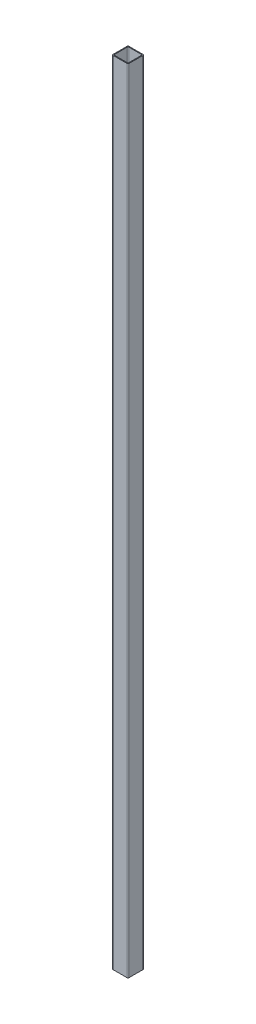
ISO-10303-21;
HEADER;
FILE_DESCRIPTION(('STEP AP214'),'2;1');
FILE_NAME('part.step','',(''),(''),'','','');
FILE_SCHEMA(('AUTOMOTIVE_DESIGN { 1 0 10303 214 1 1 1 1 }'));
ENDSEC;
DATA;
#1=APPLICATION_CONTEXT('core data for automotive mechanical design processes');
#2=APPLICATION_PROTOCOL_DEFINITION('international standard','automotive_design',2000,#1);
#3=PRODUCT_CONTEXT('',#1,'mechanical');
#4=PRODUCT('Part','Part','',(#3));
#5=PRODUCT_RELATED_PRODUCT_CATEGORY('part','',(#4));
#6=PRODUCT_DEFINITION_FORMATION('','',#4);
#7=PRODUCT_DEFINITION_CONTEXT('part definition',#1,'design');
#8=PRODUCT_DEFINITION('design','',#6,#7);
#9=PRODUCT_DEFINITION_SHAPE('','',#8);
#10=(LENGTH_UNIT() NAMED_UNIT(*) SI_UNIT(.MILLI.,.METRE.));
#11=(NAMED_UNIT(*) PLANE_ANGLE_UNIT() SI_UNIT($,.RADIAN.));
#12=(NAMED_UNIT(*) SI_UNIT($,.STERADIAN.) SOLID_ANGLE_UNIT());
#13=UNCERTAINTY_MEASURE_WITH_UNIT(LENGTH_MEASURE(1.E-05),#10,'distance_accuracy_value','');
#14=(GEOMETRIC_REPRESENTATION_CONTEXT(3) GLOBAL_UNCERTAINTY_ASSIGNED_CONTEXT((#13)) GLOBAL_UNIT_ASSIGNED_CONTEXT((#10,
#11,#12)) REPRESENTATION_CONTEXT('',''));
#15=CARTESIAN_POINT('',(0.,0.,0.));
#16=DIRECTION('',(0.,0.,1.));
#17=DIRECTION('',(1.,0.,0.));
#18=AXIS2_PLACEMENT_3D('',#15,#16,#17);
#19=CARTESIAN_POINT('',(18.,2000.,18.));
#20=DIRECTION('',(0.,1.,0.));
#21=DIRECTION('',(0.,0.,1.));
#22=AXIS2_PLACEMENT_3D('',#19,#20,#21);
#23=PLANE('',#22);
#24=CARTESIAN_POINT('',(18.,2000.,18.));
#25=DIRECTION('',(0.,1.,0.));
#26=DIRECTION('',(0.,0.,1.));
#27=AXIS2_PLACEMENT_3D('',#24,#25,#26);
#28=CIRCLE('',#27,2.);
#29=CARTESIAN_POINT('',(18.,2000.,20.));
#30=VERTEX_POINT('',#29);
#31=CARTESIAN_POINT('',(20.,2000.,18.));
#32=VERTEX_POINT('',#31);
#33=EDGE_CURVE('E213',#30,#32,#28,.T.);
#34=ORIENTED_EDGE('',*,*,#33,.T.);
#35=DIRECTION('',(0.,0.,-1.));
#36=VECTOR('',#35,1.);
#37=CARTESIAN_POINT('',(20.,2000.,-18.));
#38=LINE('',#37,#36);
#39=CARTESIAN_POINT('',(20.,2000.,-18.));
#40=VERTEX_POINT('',#39);
#41=EDGE_CURVE('E216',#32,#40,#38,.T.);
#42=ORIENTED_EDGE('',*,*,#41,.T.);
#43=CARTESIAN_POINT('',(18.,2000.,-18.));
#44=DIRECTION('',(0.,1.,0.));
#45=DIRECTION('',(0.,0.,-1.));
#46=AXIS2_PLACEMENT_3D('',#43,#44,#45);
#47=CIRCLE('',#46,2.);
#48=CARTESIAN_POINT('',(18.,2000.,-20.));
#49=VERTEX_POINT('',#48);
#50=EDGE_CURVE('E219',#40,#49,#47,.T.);
#51=ORIENTED_EDGE('',*,*,#50,.T.);
#52=DIRECTION('',(-1.,0.,0.));
#53=VECTOR('',#52,1.);
#54=CARTESIAN_POINT('',(-18.,2000.,-20.));
#55=LINE('',#54,#53);
#56=CARTESIAN_POINT('',(-18.,2000.,-20.));
#57=VERTEX_POINT('',#56);
#58=EDGE_CURVE('E221',#49,#57,#55,.T.);
#59=ORIENTED_EDGE('',*,*,#58,.T.);
#60=CARTESIAN_POINT('',(-18.,2000.,-18.));
#61=DIRECTION('',(0.,1.,0.));
#62=DIRECTION('',(0.,0.,1.));
#63=AXIS2_PLACEMENT_3D('',#60,#61,#62);
#64=CIRCLE('',#63,2.);
#65=CARTESIAN_POINT('',(-20.,2000.,-18.));
#66=VERTEX_POINT('',#65);
#67=EDGE_CURVE('E223',#57,#66,#64,.T.);
#68=ORIENTED_EDGE('',*,*,#67,.T.);
#69=DIRECTION('',(0.,0.,1.));
#70=VECTOR('',#69,1.);
#71=CARTESIAN_POINT('',(-20.,2000.,-18.));
#72=LINE('',#71,#70);
#73=CARTESIAN_POINT('',(-20.,2000.,18.));
#74=VERTEX_POINT('',#73);
#75=EDGE_CURVE('E225',#66,#74,#72,.T.);
#76=ORIENTED_EDGE('',*,*,#75,.T.);
#77=CARTESIAN_POINT('',(-18.,2000.,18.));
#78=DIRECTION('',(0.,1.,0.));
#79=DIRECTION('',(0.,0.,1.));
#80=AXIS2_PLACEMENT_3D('',#77,#78,#79);
#81=CIRCLE('',#80,2.);
#82=CARTESIAN_POINT('',(-18.,2000.,20.));
#83=VERTEX_POINT('',#82);
#84=EDGE_CURVE('E227',#74,#83,#81,.T.);
#85=ORIENTED_EDGE('',*,*,#84,.T.);
#86=DIRECTION('',(1.,0.,0.));
#87=VECTOR('',#86,1.);
#88=CARTESIAN_POINT('',(-18.,2000.,20.));
#89=LINE('',#88,#87);
#90=EDGE_CURVE('E229',#83,#30,#89,.T.);
#91=ORIENTED_EDGE('',*,*,#90,.T.);
#92=EDGE_LOOP('',(#34,#42,#51,#59,#68,#76,#85,#91));
#93=FACE_BOUND('',#92,.T.);
#94=DIRECTION('',(0.,0.,-1.));
#95=VECTOR('',#94,1.);
#96=CARTESIAN_POINT('',(18.,2000.,16.));
#97=LINE('',#96,#95);
#98=CARTESIAN_POINT('',(18.,2000.,16.));
#99=VERTEX_POINT('',#98);
#100=CARTESIAN_POINT('',(18.,2000.,-16.));
#101=VERTEX_POINT('',#100);
#102=EDGE_CURVE('E156',#99,#101,#97,.T.);
#103=ORIENTED_EDGE('',*,*,#102,.F.);
#104=CARTESIAN_POINT('',(16.,2000.,16.));
#105=DIRECTION('',(0.,1.,0.));
#106=DIRECTION('',(0.,0.,1.));
#107=AXIS2_PLACEMENT_3D('',#104,#105,#106);
#108=CIRCLE('',#107,2.);
#109=CARTESIAN_POINT('',(16.,2000.,18.));
#110=VERTEX_POINT('',#109);
#111=EDGE_CURVE('E148',#110,#99,#108,.T.);
#112=ORIENTED_EDGE('',*,*,#111,.F.);
#113=DIRECTION('',(1.,0.,0.));
#114=VECTOR('',#113,1.);
#115=CARTESIAN_POINT('',(16.,2000.,18.));
#116=LINE('',#115,#114);
#117=CARTESIAN_POINT('',(-16.,2000.,18.));
#118=VERTEX_POINT('',#117);
#119=EDGE_CURVE('E181',#118,#110,#116,.T.);
#120=ORIENTED_EDGE('',*,*,#119,.F.);
#121=CARTESIAN_POINT('',(-16.,2000.,16.));
#122=DIRECTION('',(0.,1.,0.));
#123=DIRECTION('',(0.,0.,-1.));
#124=AXIS2_PLACEMENT_3D('',#121,#122,#123);
#125=CIRCLE('',#124,2.);
#126=CARTESIAN_POINT('',(-18.,2000.,16.));
#127=VERTEX_POINT('',#126);
#128=EDGE_CURVE('E179',#127,#118,#125,.T.);
#129=ORIENTED_EDGE('',*,*,#128,.F.);
#130=DIRECTION('',(0.,0.,1.));
#131=VECTOR('',#130,1.);
#132=CARTESIAN_POINT('',(-18.,2000.,16.));
#133=LINE('',#132,#131);
#134=CARTESIAN_POINT('',(-18.,2000.,-16.));
#135=VERTEX_POINT('',#134);
#136=EDGE_CURVE('E177',#135,#127,#133,.T.);
#137=ORIENTED_EDGE('',*,*,#136,.F.);
#138=CARTESIAN_POINT('',(-16.,2000.,-16.));
#139=DIRECTION('',(0.,1.,0.));
#140=DIRECTION('',(0.,0.,1.));
#141=AXIS2_PLACEMENT_3D('',#138,#139,#140);
#142=CIRCLE('',#141,2.);
#143=CARTESIAN_POINT('',(-16.,2000.,-18.));
#144=VERTEX_POINT('',#143);
#145=EDGE_CURVE('E175',#144,#135,#142,.T.);
#146=ORIENTED_EDGE('',*,*,#145,.F.);
#147=DIRECTION('',(-1.,0.,0.));
#148=VECTOR('',#147,1.);
#149=CARTESIAN_POINT('',(16.,2000.,-18.));
#150=LINE('',#149,#148);
#151=CARTESIAN_POINT('',(16.,2000.,-18.));
#152=VERTEX_POINT('',#151);
#153=EDGE_CURVE('E171',#152,#144,#150,.T.);
#154=ORIENTED_EDGE('',*,*,#153,.F.);
#155=CARTESIAN_POINT('',(16.,2000.,-16.));
#156=DIRECTION('',(0.,1.,0.));
#157=DIRECTION('',(0.,0.,1.));
#158=AXIS2_PLACEMENT_3D('',#155,#156,#157);
#159=CIRCLE('',#158,2.);
#160=EDGE_CURVE('E169',#101,#152,#159,.T.);
#161=ORIENTED_EDGE('',*,*,#160,.F.);
#162=EDGE_LOOP('',(#103,#112,#120,#129,#137,#146,#154,#161));
#163=FACE_BOUND('',#162,.T.);
#164=ADVANCED_FACE('F35',(#93,#163),#23,.T.);
#165=CARTESIAN_POINT('',(18.,0.,18.));
#166=DIRECTION('',(0.,1.,0.));
#167=DIRECTION('',(0.,0.,1.));
#168=AXIS2_PLACEMENT_3D('',#165,#166,#167);
#169=PLANE('',#168);
#170=CARTESIAN_POINT('',(18.,0.,18.));
#171=DIRECTION('',(0.,1.,0.));
#172=DIRECTION('',(0.,0.,1.));
#173=AXIS2_PLACEMENT_3D('',#170,#171,#172);
#174=CIRCLE('',#173,2.);
#175=CARTESIAN_POINT('',(18.,0.,20.));
#176=VERTEX_POINT('',#175);
#177=CARTESIAN_POINT('',(20.,0.,18.));
#178=VERTEX_POINT('',#177);
#179=EDGE_CURVE('E164',#176,#178,#174,.T.);
#180=ORIENTED_EDGE('',*,*,#179,.F.);
#181=DIRECTION('',(1.,0.,0.));
#182=VECTOR('',#181,1.);
#183=CARTESIAN_POINT('',(-18.,0.,20.));
#184=LINE('',#183,#182);
#185=CARTESIAN_POINT('',(-18.,0.,20.));
#186=VERTEX_POINT('',#185);
#187=EDGE_CURVE('E217',#186,#176,#184,.T.);
#188=ORIENTED_EDGE('',*,*,#187,.F.);
#189=CARTESIAN_POINT('',(-18.,0.,18.));
#190=DIRECTION('',(0.,1.,0.));
#191=DIRECTION('',(0.,0.,1.));
#192=AXIS2_PLACEMENT_3D('',#189,#190,#191);
#193=CIRCLE('',#192,2.);
#194=CARTESIAN_POINT('',(-20.,0.,18.));
#195=VERTEX_POINT('',#194);
#196=EDGE_CURVE('E244',#195,#186,#193,.T.);
#197=ORIENTED_EDGE('',*,*,#196,.F.);
#198=DIRECTION('',(0.,0.,1.));
#199=VECTOR('',#198,1.);
#200=CARTESIAN_POINT('',(-20.,0.,-18.));
#201=LINE('',#200,#199);
#202=CARTESIAN_POINT('',(-20.,0.,-18.));
#203=VERTEX_POINT('',#202);
#204=EDGE_CURVE('E242',#203,#195,#201,.T.);
#205=ORIENTED_EDGE('',*,*,#204,.F.);
#206=CARTESIAN_POINT('',(-18.,0.,-18.));
#207=DIRECTION('',(0.,1.,0.));
#208=DIRECTION('',(0.,0.,1.));
#209=AXIS2_PLACEMENT_3D('',#206,#207,#208);
#210=CIRCLE('',#209,2.);
#211=CARTESIAN_POINT('',(-18.,0.,-20.));
#212=VERTEX_POINT('',#211);
#213=EDGE_CURVE('E240',#212,#203,#210,.T.);
#214=ORIENTED_EDGE('',*,*,#213,.F.);
#215=DIRECTION('',(-1.,0.,0.));
#216=VECTOR('',#215,1.);
#217=CARTESIAN_POINT('',(-18.,0.,-20.));
#218=LINE('',#217,#216);
#219=CARTESIAN_POINT('',(18.,0.,-20.));
#220=VERTEX_POINT('',#219);
#221=EDGE_CURVE('E238',#220,#212,#218,.T.);
#222=ORIENTED_EDGE('',*,*,#221,.F.);
#223=CARTESIAN_POINT('',(18.,0.,-18.));
#224=DIRECTION('',(0.,1.,0.));
#225=DIRECTION('',(0.,0.,-1.));
#226=AXIS2_PLACEMENT_3D('',#223,#224,#225);
#227=CIRCLE('',#226,2.);
#228=CARTESIAN_POINT('',(20.,0.,-18.));
#229=VERTEX_POINT('',#228);
#230=EDGE_CURVE('E236',#229,#220,#227,.T.);
#231=ORIENTED_EDGE('',*,*,#230,.F.);
#232=DIRECTION('',(0.,0.,-1.));
#233=VECTOR('',#232,1.);
#234=CARTESIAN_POINT('',(20.,0.,-18.));
#235=LINE('',#234,#233);
#236=EDGE_CURVE('E234',#178,#229,#235,.T.);
#237=ORIENTED_EDGE('',*,*,#236,.F.);
#238=EDGE_LOOP('',(#180,#188,#197,#205,#214,#222,#231,#237));
#239=FACE_BOUND('',#238,.T.);
#240=CARTESIAN_POINT('',(16.,0.,16.));
#241=DIRECTION('',(0.,1.,0.));
#242=DIRECTION('',(0.,0.,1.));
#243=AXIS2_PLACEMENT_3D('',#240,#241,#242);
#244=CIRCLE('',#243,2.);
#245=CARTESIAN_POINT('',(16.,0.,18.));
#246=VERTEX_POINT('',#245);
#247=CARTESIAN_POINT('',(18.,0.,16.));
#248=VERTEX_POINT('',#247);
#249=EDGE_CURVE('E58',#246,#248,#244,.T.);
#250=ORIENTED_EDGE('',*,*,#249,.T.);
#251=DIRECTION('',(0.,0.,-1.));
#252=VECTOR('',#251,1.);
#253=CARTESIAN_POINT('',(18.,0.,16.));
#254=LINE('',#253,#252);
#255=CARTESIAN_POINT('',(18.,0.,-16.));
#256=VERTEX_POINT('',#255);
#257=EDGE_CURVE('E163',#248,#256,#254,.T.);
#258=ORIENTED_EDGE('',*,*,#257,.T.);
#259=CARTESIAN_POINT('',(16.,0.,-16.));
#260=DIRECTION('',(0.,1.,0.));
#261=DIRECTION('',(0.,0.,1.));
#262=AXIS2_PLACEMENT_3D('',#259,#260,#261);
#263=CIRCLE('',#262,2.);
#264=CARTESIAN_POINT('',(16.,0.,-18.));
#265=VERTEX_POINT('',#264);
#266=EDGE_CURVE('E185',#256,#265,#263,.T.);
#267=ORIENTED_EDGE('',*,*,#266,.T.);
#268=DIRECTION('',(-1.,0.,0.));
#269=VECTOR('',#268,1.);
#270=CARTESIAN_POINT('',(16.,0.,-18.));
#271=LINE('',#270,#269);
#272=CARTESIAN_POINT('',(-16.,0.,-18.));
#273=VERTEX_POINT('',#272);
#274=EDGE_CURVE('E188',#265,#273,#271,.T.);
#275=ORIENTED_EDGE('',*,*,#274,.T.);
#276=CARTESIAN_POINT('',(-16.,0.,-16.));
#277=DIRECTION('',(0.,1.,0.));
#278=DIRECTION('',(0.,0.,1.));
#279=AXIS2_PLACEMENT_3D('',#276,#277,#278);
#280=CIRCLE('',#279,2.);
#281=CARTESIAN_POINT('',(-18.,0.,-16.));
#282=VERTEX_POINT('',#281);
#283=EDGE_CURVE('E191',#273,#282,#280,.T.);
#284=ORIENTED_EDGE('',*,*,#283,.T.);
#285=DIRECTION('',(0.,0.,1.));
#286=VECTOR('',#285,1.);
#287=CARTESIAN_POINT('',(-18.,0.,16.));
#288=LINE('',#287,#286);
#289=CARTESIAN_POINT('',(-18.,0.,16.));
#290=VERTEX_POINT('',#289);
#291=EDGE_CURVE('E194',#282,#290,#288,.T.);
#292=ORIENTED_EDGE('',*,*,#291,.T.);
#293=CARTESIAN_POINT('',(-16.,0.,16.));
#294=DIRECTION('',(0.,1.,0.));
#295=DIRECTION('',(0.,0.,-1.));
#296=AXIS2_PLACEMENT_3D('',#293,#294,#295);
#297=CIRCLE('',#296,2.);
#298=CARTESIAN_POINT('',(-16.,0.,18.));
#299=VERTEX_POINT('',#298);
#300=EDGE_CURVE('E197',#290,#299,#297,.T.);
#301=ORIENTED_EDGE('',*,*,#300,.T.);
#302=DIRECTION('',(1.,0.,0.));
#303=VECTOR('',#302,1.);
#304=CARTESIAN_POINT('',(16.,0.,18.));
#305=LINE('',#304,#303);
#306=EDGE_CURVE('E157',#299,#246,#305,.T.);
#307=ORIENTED_EDGE('',*,*,#306,.T.);
#308=EDGE_LOOP('',(#250,#258,#267,#275,#284,#292,#301,#307));
#309=FACE_BOUND('',#308,.T.);
#310=ADVANCED_FACE('F274',(#239,#309),#169,.F.);
#311=CARTESIAN_POINT('',(18.,2000.,18.));
#312=DIRECTION('',(0.,-1.,0.));
#313=DIRECTION('',(0.,0.,-1.));
#314=AXIS2_PLACEMENT_3D('',#311,#312,#313);
#315=CYLINDRICAL_SURFACE('',#314,2.);
#316=ORIENTED_EDGE('',*,*,#179,.T.);
#317=DIRECTION('',(0.,-1.,0.));
#318=VECTOR('',#317,1.);
#319=CARTESIAN_POINT('',(20.,2000.,18.));
#320=LINE('',#319,#318);
#321=EDGE_CURVE('E11',#32,#178,#320,.T.);
#322=ORIENTED_EDGE('',*,*,#321,.F.);
#323=ORIENTED_EDGE('',*,*,#33,.F.);
#324=DIRECTION('',(0.,-1.,0.));
#325=VECTOR('',#324,1.);
#326=CARTESIAN_POINT('',(18.,2000.,20.));
#327=LINE('',#326,#325);
#328=EDGE_CURVE('E231',#30,#176,#327,.T.);
#329=ORIENTED_EDGE('',*,*,#328,.T.);
#330=EDGE_LOOP('',(#316,#322,#323,#329));
#331=FACE_BOUND('',#330,.T.);
#332=ADVANCED_FACE('F37',(#331),#315,.T.);
#333=CARTESIAN_POINT('',(20.,2000.,-18.));
#334=DIRECTION('',(-1.,0.,0.));
#335=DIRECTION('',(0.,0.,1.));
#336=AXIS2_PLACEMENT_3D('',#333,#334,#335);
#337=PLANE('',#336);
#338=ORIENTED_EDGE('',*,*,#236,.T.);
#339=DIRECTION('',(0.,-1.,0.));
#340=VECTOR('',#339,1.);
#341=CARTESIAN_POINT('',(20.,2000.,-18.));
#342=LINE('',#341,#340);
#343=EDGE_CURVE('E43',#40,#229,#342,.T.);
#344=ORIENTED_EDGE('',*,*,#343,.F.);
#345=ORIENTED_EDGE('',*,*,#41,.F.);
#346=ORIENTED_EDGE('',*,*,#321,.T.);
#347=EDGE_LOOP('',(#338,#344,#345,#346));
#348=FACE_BOUND('',#347,.T.);
#349=ADVANCED_FACE('F291',(#348),#337,.F.);
#350=CARTESIAN_POINT('',(18.,2000.,-18.));
#351=DIRECTION('',(0.,-1.,0.));
#352=DIRECTION('',(0.,0.,-1.));
#353=AXIS2_PLACEMENT_3D('',#350,#351,#352);
#354=CYLINDRICAL_SURFACE('',#353,2.);
#355=ORIENTED_EDGE('',*,*,#230,.T.);
#356=DIRECTION('',(0.,-1.,0.));
#357=VECTOR('',#356,1.);
#358=CARTESIAN_POINT('',(18.,2000.,-20.));
#359=LINE('',#358,#357);
#360=EDGE_CURVE('E261',#49,#220,#359,.T.);
#361=ORIENTED_EDGE('',*,*,#360,.F.);
#362=ORIENTED_EDGE('',*,*,#50,.F.);
#363=ORIENTED_EDGE('',*,*,#343,.T.);
#364=EDGE_LOOP('',(#355,#361,#362,#363));
#365=FACE_BOUND('',#364,.T.);
#366=ADVANCED_FACE('F268',(#365),#354,.T.);
#367=CARTESIAN_POINT('',(-18.,2000.,-20.));
#368=DIRECTION('',(0.,0.,1.));
#369=DIRECTION('',(1.,0.,0.));
#370=AXIS2_PLACEMENT_3D('',#367,#368,#369);
#371=PLANE('',#370);
#372=ORIENTED_EDGE('',*,*,#221,.T.);
#373=DIRECTION('',(0.,-1.,0.));
#374=VECTOR('',#373,1.);
#375=CARTESIAN_POINT('',(-18.,2000.,-20.));
#376=LINE('',#375,#374);
#377=EDGE_CURVE('E258',#57,#212,#376,.T.);
#378=ORIENTED_EDGE('',*,*,#377,.F.);
#379=ORIENTED_EDGE('',*,*,#58,.F.);
#380=ORIENTED_EDGE('',*,*,#360,.T.);
#381=EDGE_LOOP('',(#372,#378,#379,#380));
#382=FACE_BOUND('',#381,.T.);
#383=ADVANCED_FACE('F280',(#382),#371,.F.);
#384=CARTESIAN_POINT('',(-18.,2000.,-18.));
#385=DIRECTION('',(0.,-1.,0.));
#386=DIRECTION('',(0.,0.,-1.));
#387=AXIS2_PLACEMENT_3D('',#384,#385,#386);
#388=CYLINDRICAL_SURFACE('',#387,2.);
#389=ORIENTED_EDGE('',*,*,#213,.T.);
#390=DIRECTION('',(0.,-1.,0.));
#391=VECTOR('',#390,1.);
#392=CARTESIAN_POINT('',(-20.,2000.,-18.));
#393=LINE('',#392,#391);
#394=EDGE_CURVE('E255',#66,#203,#393,.T.);
#395=ORIENTED_EDGE('',*,*,#394,.F.);
#396=ORIENTED_EDGE('',*,*,#67,.F.);
#397=ORIENTED_EDGE('',*,*,#377,.T.);
#398=EDGE_LOOP('',(#389,#395,#396,#397));
#399=FACE_BOUND('',#398,.T.);
#400=ADVANCED_FACE('F284',(#399),#388,.T.);
#401=CARTESIAN_POINT('',(-20.,2000.,-18.));
#402=DIRECTION('',(1.,0.,0.));
#403=DIRECTION('',(0.,0.,-1.));
#404=AXIS2_PLACEMENT_3D('',#401,#402,#403);
#405=PLANE('',#404);
#406=ORIENTED_EDGE('',*,*,#204,.T.);
#407=DIRECTION('',(0.,-1.,0.));
#408=VECTOR('',#407,1.);
#409=CARTESIAN_POINT('',(-20.,2000.,18.));
#410=LINE('',#409,#408);
#411=EDGE_CURVE('E252',#74,#195,#410,.T.);
#412=ORIENTED_EDGE('',*,*,#411,.F.);
#413=ORIENTED_EDGE('',*,*,#75,.F.);
#414=ORIENTED_EDGE('',*,*,#394,.T.);
#415=EDGE_LOOP('',(#406,#412,#413,#414));
#416=FACE_BOUND('',#415,.T.);
#417=ADVANCED_FACE('F304',(#416),#405,.F.);
#418=CARTESIAN_POINT('',(-18.,2000.,18.));
#419=DIRECTION('',(0.,-1.,0.));
#420=DIRECTION('',(0.,0.,-1.));
#421=AXIS2_PLACEMENT_3D('',#418,#419,#420);
#422=CYLINDRICAL_SURFACE('',#421,2.);
#423=ORIENTED_EDGE('',*,*,#196,.T.);
#424=DIRECTION('',(0.,-1.,0.));
#425=VECTOR('',#424,1.);
#426=CARTESIAN_POINT('',(-18.,2000.,20.));
#427=LINE('',#426,#425);
#428=EDGE_CURVE('E249',#83,#186,#427,.T.);
#429=ORIENTED_EDGE('',*,*,#428,.F.);
#430=ORIENTED_EDGE('',*,*,#84,.F.);
#431=ORIENTED_EDGE('',*,*,#411,.T.);
#432=EDGE_LOOP('',(#423,#429,#430,#431));
#433=FACE_BOUND('',#432,.T.);
#434=ADVANCED_FACE('F302',(#433),#422,.T.);
#435=CARTESIAN_POINT('',(-18.,2000.,20.));
#436=DIRECTION('',(0.,0.,-1.));
#437=DIRECTION('',(-1.,0.,0.));
#438=AXIS2_PLACEMENT_3D('',#435,#436,#437);
#439=PLANE('',#438);
#440=ORIENTED_EDGE('',*,*,#187,.T.);
#441=ORIENTED_EDGE('',*,*,#328,.F.);
#442=ORIENTED_EDGE('',*,*,#90,.F.);
#443=ORIENTED_EDGE('',*,*,#428,.T.);
#444=EDGE_LOOP('',(#440,#441,#442,#443));
#445=FACE_BOUND('',#444,.T.);
#446=ADVANCED_FACE('F297',(#445),#439,.F.);
#447=CARTESIAN_POINT('',(16.,2000.,16.));
#448=DIRECTION('',(0.,-1.,0.));
#449=DIRECTION('',(0.,0.,-1.));
#450=AXIS2_PLACEMENT_3D('',#447,#448,#449);
#451=CYLINDRICAL_SURFACE('',#450,2.);
#452=ORIENTED_EDGE('',*,*,#249,.F.);
#453=DIRECTION('',(0.,-1.,0.));
#454=VECTOR('',#453,1.);
#455=CARTESIAN_POINT('',(16.,2000.,18.));
#456=LINE('',#455,#454);
#457=EDGE_CURVE('E152',#110,#246,#456,.T.);
#458=ORIENTED_EDGE('',*,*,#457,.F.);
#459=ORIENTED_EDGE('',*,*,#111,.T.);
#460=DIRECTION('',(0.,-1.,0.));
#461=VECTOR('',#460,1.);
#462=CARTESIAN_POINT('',(18.,2000.,16.));
#463=LINE('',#462,#461);
#464=EDGE_CURVE('E151',#99,#248,#463,.T.);
#465=ORIENTED_EDGE('',*,*,#464,.T.);
#466=EDGE_LOOP('',(#452,#458,#459,#465));
#467=FACE_BOUND('',#466,.T.);
#468=ADVANCED_FACE('F150',(#467),#451,.F.);
#469=CARTESIAN_POINT('',(18.,2000.,16.));
#470=DIRECTION('',(-1.,0.,0.));
#471=DIRECTION('',(0.,0.,1.));
#472=AXIS2_PLACEMENT_3D('',#469,#470,#471);
#473=PLANE('',#472);
#474=ORIENTED_EDGE('',*,*,#257,.F.);
#475=ORIENTED_EDGE('',*,*,#464,.F.);
#476=ORIENTED_EDGE('',*,*,#102,.T.);
#477=DIRECTION('',(0.,-1.,0.));
#478=VECTOR('',#477,1.);
#479=CARTESIAN_POINT('',(18.,2000.,-16.));
#480=LINE('',#479,#478);
#481=EDGE_CURVE('E165',#101,#256,#480,.T.);
#482=ORIENTED_EDGE('',*,*,#481,.T.);
#483=EDGE_LOOP('',(#474,#475,#476,#482));
#484=FACE_BOUND('',#483,.T.);
#485=ADVANCED_FACE('F160',(#484),#473,.T.);
#486=CARTESIAN_POINT('',(16.,2000.,-16.));
#487=DIRECTION('',(0.,-1.,0.));
#488=DIRECTION('',(0.,0.,-1.));
#489=AXIS2_PLACEMENT_3D('',#486,#487,#488);
#490=CYLINDRICAL_SURFACE('',#489,2.);
#491=ORIENTED_EDGE('',*,*,#266,.F.);
#492=ORIENTED_EDGE('',*,*,#481,.F.);
#493=ORIENTED_EDGE('',*,*,#160,.T.);
#494=DIRECTION('',(0.,-1.,0.));
#495=VECTOR('',#494,1.);
#496=CARTESIAN_POINT('',(16.,2000.,-18.));
#497=LINE('',#496,#495);
#498=EDGE_CURVE('E210',#152,#265,#497,.T.);
#499=ORIENTED_EDGE('',*,*,#498,.T.);
#500=EDGE_LOOP('',(#491,#492,#493,#499));
#501=FACE_BOUND('',#500,.T.);
#502=ADVANCED_FACE('F329',(#501),#490,.F.);
#503=CARTESIAN_POINT('',(16.,2000.,-18.));
#504=DIRECTION('',(0.,0.,1.));
#505=DIRECTION('',(1.,0.,0.));
#506=AXIS2_PLACEMENT_3D('',#503,#504,#505);
#507=PLANE('',#506);
#508=ORIENTED_EDGE('',*,*,#274,.F.);
#509=ORIENTED_EDGE('',*,*,#498,.F.);
#510=ORIENTED_EDGE('',*,*,#153,.T.);
#511=DIRECTION('',(0.,-1.,0.));
#512=VECTOR('',#511,1.);
#513=CARTESIAN_POINT('',(-16.,2000.,-18.));
#514=LINE('',#513,#512);
#515=EDGE_CURVE('E208',#144,#273,#514,.T.);
#516=ORIENTED_EDGE('',*,*,#515,.T.);
#517=EDGE_LOOP('',(#508,#509,#510,#516));
#518=FACE_BOUND('',#517,.T.);
#519=ADVANCED_FACE('F333',(#518),#507,.T.);
#520=CARTESIAN_POINT('',(-16.,2000.,-16.));
#521=DIRECTION('',(0.,-1.,0.));
#522=DIRECTION('',(0.,0.,-1.));
#523=AXIS2_PLACEMENT_3D('',#520,#521,#522);
#524=CYLINDRICAL_SURFACE('',#523,2.);
#525=ORIENTED_EDGE('',*,*,#283,.F.);
#526=ORIENTED_EDGE('',*,*,#515,.F.);
#527=ORIENTED_EDGE('',*,*,#145,.T.);
#528=DIRECTION('',(0.,-1.,0.));
#529=VECTOR('',#528,1.);
#530=CARTESIAN_POINT('',(-18.,2000.,-16.));
#531=LINE('',#530,#529);
#532=EDGE_CURVE('E206',#135,#282,#531,.T.);
#533=ORIENTED_EDGE('',*,*,#532,.T.);
#534=EDGE_LOOP('',(#525,#526,#527,#533));
#535=FACE_BOUND('',#534,.T.);
#536=ADVANCED_FACE('F339',(#535),#524,.F.);
#537=CARTESIAN_POINT('',(-18.,2000.,16.));
#538=DIRECTION('',(1.,0.,0.));
#539=DIRECTION('',(0.,0.,-1.));
#540=AXIS2_PLACEMENT_3D('',#537,#538,#539);
#541=PLANE('',#540);
#542=ORIENTED_EDGE('',*,*,#291,.F.);
#543=ORIENTED_EDGE('',*,*,#532,.F.);
#544=ORIENTED_EDGE('',*,*,#136,.T.);
#545=DIRECTION('',(0.,-1.,0.));
#546=VECTOR('',#545,1.);
#547=CARTESIAN_POINT('',(-18.,2000.,16.));
#548=LINE('',#547,#546);
#549=EDGE_CURVE('E204',#127,#290,#548,.T.);
#550=ORIENTED_EDGE('',*,*,#549,.T.);
#551=EDGE_LOOP('',(#542,#543,#544,#550));
#552=FACE_BOUND('',#551,.T.);
#553=ADVANCED_FACE('F343',(#552),#541,.T.);
#554=CARTESIAN_POINT('',(-16.,2000.,16.));
#555=DIRECTION('',(0.,-1.,0.));
#556=DIRECTION('',(0.,0.,-1.));
#557=AXIS2_PLACEMENT_3D('',#554,#555,#556);
#558=CYLINDRICAL_SURFACE('',#557,2.);
#559=ORIENTED_EDGE('',*,*,#300,.F.);
#560=ORIENTED_EDGE('',*,*,#549,.F.);
#561=ORIENTED_EDGE('',*,*,#128,.T.);
#562=DIRECTION('',(0.,-1.,0.));
#563=VECTOR('',#562,1.);
#564=CARTESIAN_POINT('',(-16.,2000.,18.));
#565=LINE('',#564,#563);
#566=EDGE_CURVE('E50',#118,#299,#565,.T.);
#567=ORIENTED_EDGE('',*,*,#566,.T.);
#568=EDGE_LOOP('',(#559,#560,#561,#567));
#569=FACE_BOUND('',#568,.T.);
#570=ADVANCED_FACE('F347',(#569),#558,.F.);
#571=CARTESIAN_POINT('',(16.,2000.,18.));
#572=DIRECTION('',(0.,0.,-1.));
#573=DIRECTION('',(-1.,0.,0.));
#574=AXIS2_PLACEMENT_3D('',#571,#572,#573);
#575=PLANE('',#574);
#576=ORIENTED_EDGE('',*,*,#306,.F.);
#577=ORIENTED_EDGE('',*,*,#566,.F.);
#578=ORIENTED_EDGE('',*,*,#119,.T.);
#579=ORIENTED_EDGE('',*,*,#457,.T.);
#580=EDGE_LOOP('',(#576,#577,#578,#579));
#581=FACE_BOUND('',#580,.T.);
#582=ADVANCED_FACE('F351',(#581),#575,.T.);
#583=CLOSED_SHELL('',(#164,#310,#332,#349,#366,#383,#400,#417,#434,#446,#468,#485,#502,#519,
#536,#553,#570,#582));
#584=MANIFOLD_SOLID_BREP('B2',#583);
#585=ADVANCED_BREP_SHAPE_REPRESENTATION('',(#18,#584),#14);
#586=SHAPE_DEFINITION_REPRESENTATION(#9,#585);
ENDSEC;
END-ISO-10303-21;
